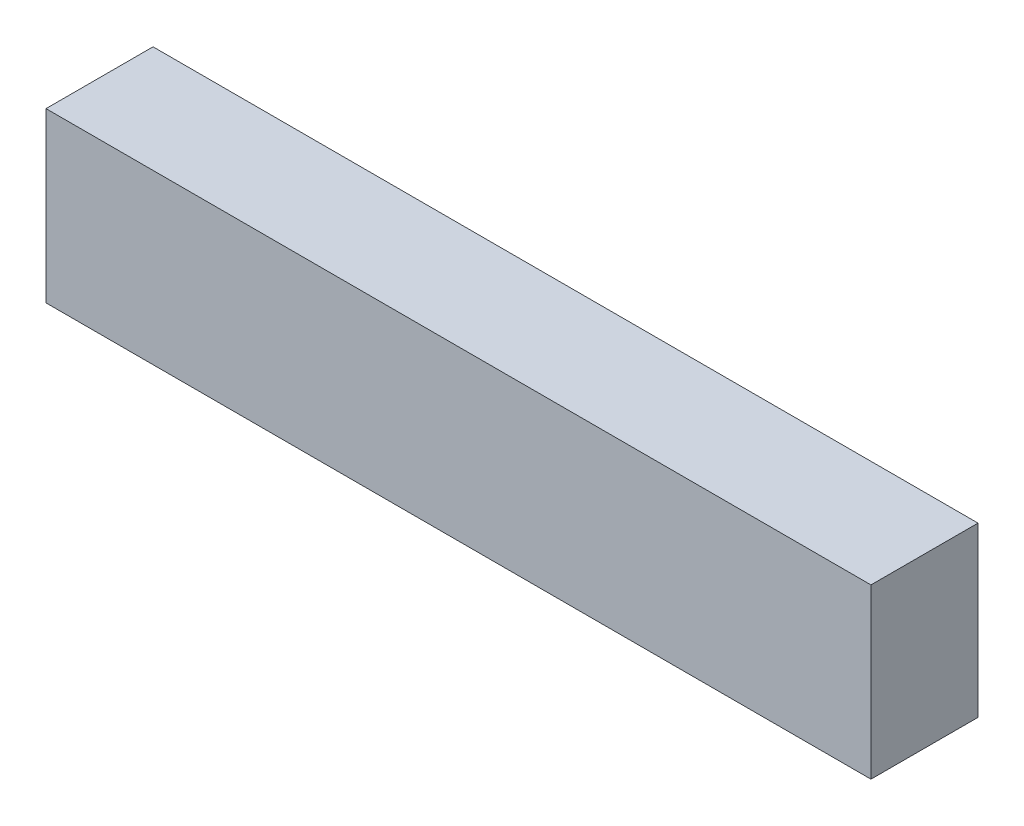
ISO-10303-21;
HEADER;
FILE_DESCRIPTION(('STEP AP214'),'2;1');
FILE_NAME('part.step','',(''),(''),'','','');
FILE_SCHEMA(('AUTOMOTIVE_DESIGN { 1 0 10303 214 1 1 1 1 }'));
ENDSEC;
DATA;
#1=APPLICATION_CONTEXT('core data for automotive mechanical design processes');
#2=APPLICATION_PROTOCOL_DEFINITION('international standard','automotive_design',2000,#1);
#3=PRODUCT_CONTEXT('',#1,'mechanical');
#4=PRODUCT('Part','Part','',(#3));
#5=PRODUCT_RELATED_PRODUCT_CATEGORY('part','',(#4));
#6=PRODUCT_DEFINITION_FORMATION('','',#4);
#7=PRODUCT_DEFINITION_CONTEXT('part definition',#1,'design');
#8=PRODUCT_DEFINITION('design','',#6,#7);
#9=PRODUCT_DEFINITION_SHAPE('','',#8);
#10=(LENGTH_UNIT() NAMED_UNIT(*) SI_UNIT(.MILLI.,.METRE.));
#11=(NAMED_UNIT(*) PLANE_ANGLE_UNIT() SI_UNIT($,.RADIAN.));
#12=(NAMED_UNIT(*) SI_UNIT($,.STERADIAN.) SOLID_ANGLE_UNIT());
#13=UNCERTAINTY_MEASURE_WITH_UNIT(LENGTH_MEASURE(1.E-05),#10,'distance_accuracy_value','');
#14=(GEOMETRIC_REPRESENTATION_CONTEXT(3) GLOBAL_UNCERTAINTY_ASSIGNED_CONTEXT((#13)) GLOBAL_UNIT_ASSIGNED_CONTEXT((#10,
#11,#12)) REPRESENTATION_CONTEXT('',''));
#15=CARTESIAN_POINT('',(0.,0.,0.));
#16=DIRECTION('',(0.,0.,1.));
#17=DIRECTION('',(1.,0.,0.));
#18=AXIS2_PLACEMENT_3D('',#15,#16,#17);
#19=CARTESIAN_POINT('',(17.65000026,-3.60000042,4.580001));
#20=DIRECTION('',(0.,0.,-1.));
#21=DIRECTION('',(0.,-1.,0.));
#22=AXIS2_PLACEMENT_3D('',#19,#20,#21);
#23=PLANE('',#22);
#24=DIRECTION('',(0.,1.,0.));
#25=VECTOR('',#24,1.);
#26=CARTESIAN_POINT('',(17.65000026,-3.60000042,4.580001));
#27=LINE('',#26,#25);
#28=CARTESIAN_POINT('',(17.65000026,-3.60000042,4.580001));
#29=VERTEX_POINT('',#28);
#30=CARTESIAN_POINT('',(17.65000026,3.60000042,4.580001));
#31=VERTEX_POINT('',#30);
#32=EDGE_CURVE('E101',#29,#31,#27,.T.);
#33=ORIENTED_EDGE('',*,*,#32,.T.);
#34=DIRECTION('',(-1.,0.,0.));
#35=VECTOR('',#34,1.);
#36=CARTESIAN_POINT('',(17.65000026,3.60000042,4.580001));
#37=LINE('',#36,#35);
#38=CARTESIAN_POINT('',(-17.65000026,3.60000042,4.580001));
#39=VERTEX_POINT('',#38);
#40=EDGE_CURVE('E21',#31,#39,#37,.T.);
#41=ORIENTED_EDGE('',*,*,#40,.T.);
#42=DIRECTION('',(0.,-1.,0.));
#43=VECTOR('',#42,1.);
#44=CARTESIAN_POINT('',(-17.65000026,3.60000042,4.580001));
#45=LINE('',#44,#43);
#46=CARTESIAN_POINT('',(-17.65000026,-3.60000042,4.580001));
#47=VERTEX_POINT('',#46);
#48=EDGE_CURVE('E86',#39,#47,#45,.T.);
#49=ORIENTED_EDGE('',*,*,#48,.T.);
#50=DIRECTION('',(1.,0.,0.));
#51=VECTOR('',#50,1.);
#52=CARTESIAN_POINT('',(-17.65000026,-3.60000042,4.580001));
#53=LINE('',#52,#51);
#54=EDGE_CURVE('E11',#47,#29,#53,.T.);
#55=ORIENTED_EDGE('',*,*,#54,.T.);
#56=EDGE_LOOP('',(#33,#41,#49,#55));
#57=FACE_BOUND('',#56,.T.);
#58=ADVANCED_FACE('F17',(#57),#23,.F.);
#59=CARTESIAN_POINT('',(17.65000026,-3.60000042,0.));
#60=DIRECTION('',(0.,0.,-1.));
#61=DIRECTION('',(0.,-1.,0.));
#62=AXIS2_PLACEMENT_3D('',#59,#60,#61);
#63=PLANE('',#62);
#64=DIRECTION('',(1.,0.,0.));
#65=VECTOR('',#64,1.);
#66=CARTESIAN_POINT('',(-17.65000026,-3.60000042,0.));
#67=LINE('',#66,#65);
#68=CARTESIAN_POINT('',(-17.65000026,-3.60000042,0.));
#69=VERTEX_POINT('',#68);
#70=CARTESIAN_POINT('',(17.65000026,-3.60000042,0.));
#71=VERTEX_POINT('',#70);
#72=EDGE_CURVE('E28',#69,#71,#67,.T.);
#73=ORIENTED_EDGE('',*,*,#72,.F.);
#74=DIRECTION('',(0.,-1.,0.));
#75=VECTOR('',#74,1.);
#76=CARTESIAN_POINT('',(-17.65000026,3.60000042,0.));
#77=LINE('',#76,#75);
#78=CARTESIAN_POINT('',(-17.65000026,3.60000042,0.));
#79=VERTEX_POINT('',#78);
#80=EDGE_CURVE('E71',#79,#69,#77,.T.);
#81=ORIENTED_EDGE('',*,*,#80,.F.);
#82=DIRECTION('',(-1.,0.,0.));
#83=VECTOR('',#82,1.);
#84=CARTESIAN_POINT('',(17.65000026,3.60000042,0.));
#85=LINE('',#84,#83);
#86=CARTESIAN_POINT('',(17.65000026,3.60000042,0.));
#87=VERTEX_POINT('',#86);
#88=EDGE_CURVE('E76',#87,#79,#85,.T.);
#89=ORIENTED_EDGE('',*,*,#88,.F.);
#90=DIRECTION('',(0.,1.,0.));
#91=VECTOR('',#90,1.);
#92=CARTESIAN_POINT('',(17.65000026,-3.60000042,0.));
#93=LINE('',#92,#91);
#94=EDGE_CURVE('E106',#71,#87,#93,.T.);
#95=ORIENTED_EDGE('',*,*,#94,.F.);
#96=EDGE_LOOP('',(#73,#81,#89,#95));
#97=FACE_BOUND('',#96,.T.);
#98=ADVANCED_FACE('F73',(#97),#63,.T.);
#99=CARTESIAN_POINT('',(-17.65000026,-3.60000042,0.));
#100=DIRECTION('',(0.,1.,0.));
#101=DIRECTION('',(1.,0.,0.));
#102=AXIS2_PLACEMENT_3D('',#99,#100,#101);
#103=PLANE('',#102);
#104=ORIENTED_EDGE('',*,*,#72,.T.);
#105=DIRECTION('',(0.,0.,1.));
#106=VECTOR('',#105,1.);
#107=CARTESIAN_POINT('',(17.65000026,-3.60000042,0.));
#108=LINE('',#107,#106);
#109=EDGE_CURVE('E95',#71,#29,#108,.T.);
#110=ORIENTED_EDGE('',*,*,#109,.T.);
#111=ORIENTED_EDGE('',*,*,#54,.F.);
#112=DIRECTION('',(0.,0.,1.));
#113=VECTOR('',#112,1.);
#114=CARTESIAN_POINT('',(-17.65000026,-3.60000042,0.));
#115=LINE('',#114,#113);
#116=EDGE_CURVE('E81',#69,#47,#115,.T.);
#117=ORIENTED_EDGE('',*,*,#116,.F.);
#118=EDGE_LOOP('',(#104,#110,#111,#117));
#119=FACE_BOUND('',#118,.T.);
#120=ADVANCED_FACE('F117',(#119),#103,.F.);
#121=CARTESIAN_POINT('',(-17.65000026,3.60000042,0.));
#122=DIRECTION('',(1.,0.,0.));
#123=DIRECTION('',(0.,1.,0.));
#124=AXIS2_PLACEMENT_3D('',#121,#122,#123);
#125=PLANE('',#124);
#126=ORIENTED_EDGE('',*,*,#80,.T.);
#127=ORIENTED_EDGE('',*,*,#116,.T.);
#128=ORIENTED_EDGE('',*,*,#48,.F.);
#129=DIRECTION('',(0.,0.,1.));
#130=VECTOR('',#129,1.);
#131=CARTESIAN_POINT('',(-17.65000026,3.60000042,0.));
#132=LINE('',#131,#130);
#133=EDGE_CURVE('E84',#79,#39,#132,.T.);
#134=ORIENTED_EDGE('',*,*,#133,.F.);
#135=EDGE_LOOP('',(#126,#127,#128,#134));
#136=FACE_BOUND('',#135,.T.);
#137=ADVANCED_FACE('F85',(#136),#125,.F.);
#138=CARTESIAN_POINT('',(17.65000026,3.60000042,0.));
#139=DIRECTION('',(0.,-1.,0.));
#140=DIRECTION('',(0.,0.,-1.));
#141=AXIS2_PLACEMENT_3D('',#138,#139,#140);
#142=PLANE('',#141);
#143=ORIENTED_EDGE('',*,*,#88,.T.);
#144=ORIENTED_EDGE('',*,*,#133,.T.);
#145=ORIENTED_EDGE('',*,*,#40,.F.);
#146=DIRECTION('',(0.,0.,1.));
#147=VECTOR('',#146,1.);
#148=CARTESIAN_POINT('',(17.65000026,3.60000042,0.));
#149=LINE('',#148,#147);
#150=EDGE_CURVE('E92',#87,#31,#149,.T.);
#151=ORIENTED_EDGE('',*,*,#150,.F.);
#152=EDGE_LOOP('',(#143,#144,#145,#151));
#153=FACE_BOUND('',#152,.T.);
#154=ADVANCED_FACE('F19',(#153),#142,.F.);
#155=CARTESIAN_POINT('',(17.65000026,-3.60000042,0.));
#156=DIRECTION('',(-1.,0.,0.));
#157=DIRECTION('',(0.,0.,1.));
#158=AXIS2_PLACEMENT_3D('',#155,#156,#157);
#159=PLANE('',#158);
#160=ORIENTED_EDGE('',*,*,#94,.T.);
#161=ORIENTED_EDGE('',*,*,#150,.T.);
#162=ORIENTED_EDGE('',*,*,#32,.F.);
#163=ORIENTED_EDGE('',*,*,#109,.F.);
#164=EDGE_LOOP('',(#160,#161,#162,#163));
#165=FACE_BOUND('',#164,.T.);
#166=ADVANCED_FACE('F115',(#165),#159,.F.);
#167=CLOSED_SHELL('',(#58,#98,#120,#137,#154,#166));
#168=MANIFOLD_SOLID_BREP('B1',#167);
#169=ADVANCED_BREP_SHAPE_REPRESENTATION('',(#18,#168),#14);
#170=SHAPE_DEFINITION_REPRESENTATION(#9,#169);
ENDSEC;
END-ISO-10303-21;
